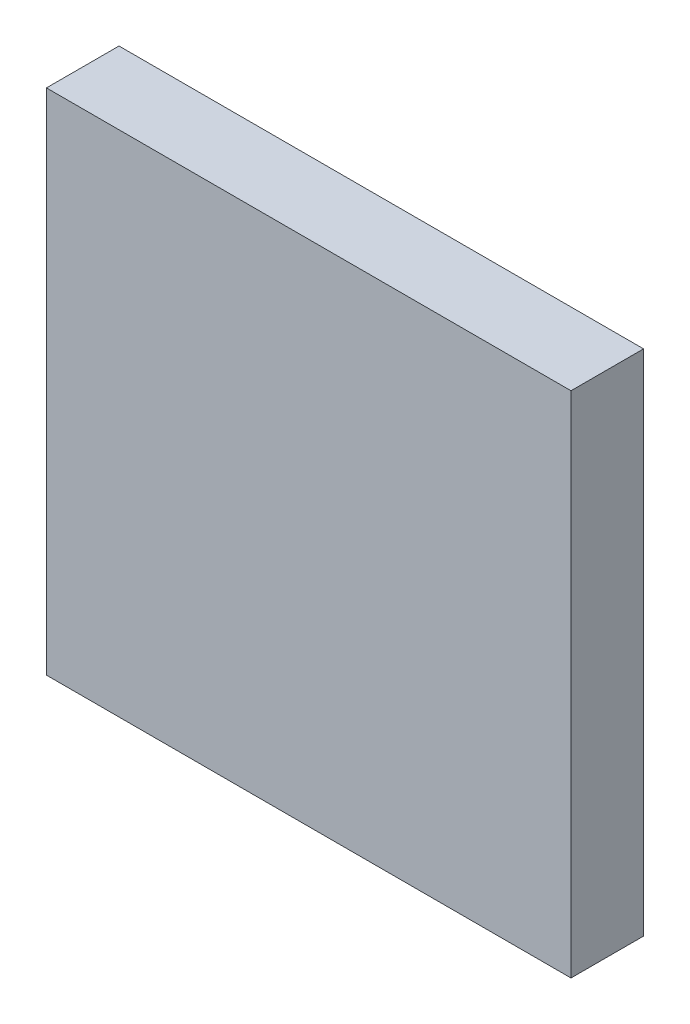
ISO-10303-21;
HEADER;
FILE_DESCRIPTION(('STEP AP214'),'2;1');
FILE_NAME('part.step','',(''),(''),'','','');
FILE_SCHEMA(('AUTOMOTIVE_DESIGN { 1 0 10303 214 1 1 1 1 }'));
ENDSEC;
DATA;
#1=APPLICATION_CONTEXT('core data for automotive mechanical design processes');
#2=APPLICATION_PROTOCOL_DEFINITION('international standard','automotive_design',2000,#1);
#3=PRODUCT_CONTEXT('',#1,'mechanical');
#4=PRODUCT('Part','Part','',(#3));
#5=PRODUCT_RELATED_PRODUCT_CATEGORY('part','',(#4));
#6=PRODUCT_DEFINITION_FORMATION('','',#4);
#7=PRODUCT_DEFINITION_CONTEXT('part definition',#1,'design');
#8=PRODUCT_DEFINITION('design','',#6,#7);
#9=PRODUCT_DEFINITION_SHAPE('','',#8);
#10=(LENGTH_UNIT() NAMED_UNIT(*) SI_UNIT(.MILLI.,.METRE.));
#11=(NAMED_UNIT(*) PLANE_ANGLE_UNIT() SI_UNIT($,.RADIAN.));
#12=(NAMED_UNIT(*) SI_UNIT($,.STERADIAN.) SOLID_ANGLE_UNIT());
#13=UNCERTAINTY_MEASURE_WITH_UNIT(LENGTH_MEASURE(1.E-05),#10,'distance_accuracy_value','');
#14=(GEOMETRIC_REPRESENTATION_CONTEXT(3) GLOBAL_UNCERTAINTY_ASSIGNED_CONTEXT((#13)) GLOBAL_UNIT_ASSIGNED_CONTEXT((#10,
#11,#12)) REPRESENTATION_CONTEXT('',''));
#15=CARTESIAN_POINT('',(0.,0.,0.));
#16=DIRECTION('',(0.,0.,1.));
#17=DIRECTION('',(1.,0.,0.));
#18=AXIS2_PLACEMENT_3D('',#15,#16,#17);
#19=CARTESIAN_POINT('',(47.,45.57,13.));
#20=DIRECTION('',(-1.,0.,0.));
#21=DIRECTION('',(0.,-1.,0.));
#22=AXIS2_PLACEMENT_3D('',#19,#20,#21);
#23=PLANE('',#22);
#24=DIRECTION('',(0.,1.,0.));
#25=VECTOR('',#24,1.);
#26=CARTESIAN_POINT('',(47.,45.57,0.));
#27=LINE('',#26,#25);
#28=CARTESIAN_POINT('',(47.,-45.57,0.));
#29=VERTEX_POINT('',#28);
#30=CARTESIAN_POINT('',(47.,45.57,0.));
#31=VERTEX_POINT('',#30);
#32=EDGE_CURVE('E99',#29,#31,#27,.T.);
#33=ORIENTED_EDGE('',*,*,#32,.T.);
#34=DIRECTION('',(0.,0.,-1.));
#35=VECTOR('',#34,1.);
#36=CARTESIAN_POINT('',(47.,45.57,13.));
#37=LINE('',#36,#35);
#38=CARTESIAN_POINT('',(47.,45.57,13.));
#39=VERTEX_POINT('',#38);
#40=EDGE_CURVE('E11',#39,#31,#37,.T.);
#41=ORIENTED_EDGE('',*,*,#40,.F.);
#42=DIRECTION('',(0.,1.,0.));
#43=VECTOR('',#42,1.);
#44=CARTESIAN_POINT('',(47.,45.57,13.));
#45=LINE('',#44,#43);
#46=CARTESIAN_POINT('',(47.,-45.57,13.));
#47=VERTEX_POINT('',#46);
#48=EDGE_CURVE('E87',#47,#39,#45,.T.);
#49=ORIENTED_EDGE('',*,*,#48,.F.);
#50=DIRECTION('',(0.,0.,-1.));
#51=VECTOR('',#50,1.);
#52=CARTESIAN_POINT('',(47.,-45.57,13.));
#53=LINE('',#52,#51);
#54=EDGE_CURVE('E95',#47,#29,#53,.T.);
#55=ORIENTED_EDGE('',*,*,#54,.T.);
#56=EDGE_LOOP('',(#33,#41,#49,#55));
#57=FACE_BOUND('',#56,.T.);
#58=ADVANCED_FACE('F36',(#57),#23,.F.);
#59=CARTESIAN_POINT('',(-47.,45.57,13.));
#60=DIRECTION('',(0.,-1.,0.));
#61=DIRECTION('',(0.,0.,-1.));
#62=AXIS2_PLACEMENT_3D('',#59,#60,#61);
#63=PLANE('',#62);
#64=DIRECTION('',(-1.,0.,0.));
#65=VECTOR('',#64,1.);
#66=CARTESIAN_POINT('',(-47.,45.57,0.));
#67=LINE('',#66,#65);
#68=CARTESIAN_POINT('',(-47.,45.57,0.));
#69=VERTEX_POINT('',#68);
#70=EDGE_CURVE('E91',#31,#69,#67,.T.);
#71=ORIENTED_EDGE('',*,*,#70,.T.);
#72=DIRECTION('',(0.,0.,-1.));
#73=VECTOR('',#72,1.);
#74=CARTESIAN_POINT('',(-47.,45.57,13.));
#75=LINE('',#74,#73);
#76=CARTESIAN_POINT('',(-47.,45.57,13.));
#77=VERTEX_POINT('',#76);
#78=EDGE_CURVE('E44',#77,#69,#75,.T.);
#79=ORIENTED_EDGE('',*,*,#78,.F.);
#80=DIRECTION('',(-1.,0.,0.));
#81=VECTOR('',#80,1.);
#82=CARTESIAN_POINT('',(-47.,45.57,13.));
#83=LINE('',#82,#81);
#84=EDGE_CURVE('E82',#39,#77,#83,.T.);
#85=ORIENTED_EDGE('',*,*,#84,.F.);
#86=ORIENTED_EDGE('',*,*,#40,.T.);
#87=EDGE_LOOP('',(#71,#79,#85,#86));
#88=FACE_BOUND('',#87,.T.);
#89=ADVANCED_FACE('F90',(#88),#63,.F.);
#90=CARTESIAN_POINT('',(-47.,45.57,13.));
#91=DIRECTION('',(1.,0.,0.));
#92=DIRECTION('',(0.,1.,0.));
#93=AXIS2_PLACEMENT_3D('',#90,#91,#92);
#94=PLANE('',#93);
#95=DIRECTION('',(0.,-1.,0.));
#96=VECTOR('',#95,1.);
#97=CARTESIAN_POINT('',(-47.,45.57,0.));
#98=LINE('',#97,#96);
#99=CARTESIAN_POINT('',(-47.,-45.57,0.));
#100=VERTEX_POINT('',#99);
#101=EDGE_CURVE('E69',#69,#100,#98,.T.);
#102=ORIENTED_EDGE('',*,*,#101,.T.);
#103=DIRECTION('',(0.,0.,-1.));
#104=VECTOR('',#103,1.);
#105=CARTESIAN_POINT('',(-47.,-45.57,13.));
#106=LINE('',#105,#104);
#107=CARTESIAN_POINT('',(-47.,-45.57,13.));
#108=VERTEX_POINT('',#107);
#109=EDGE_CURVE('E92',#108,#100,#106,.T.);
#110=ORIENTED_EDGE('',*,*,#109,.F.);
#111=DIRECTION('',(0.,-1.,0.));
#112=VECTOR('',#111,1.);
#113=CARTESIAN_POINT('',(-47.,45.57,13.));
#114=LINE('',#113,#112);
#115=EDGE_CURVE('E85',#77,#108,#114,.T.);
#116=ORIENTED_EDGE('',*,*,#115,.F.);
#117=ORIENTED_EDGE('',*,*,#78,.T.);
#118=EDGE_LOOP('',(#102,#110,#116,#117));
#119=FACE_BOUND('',#118,.T.);
#120=ADVANCED_FACE('F93',(#119),#94,.F.);
#121=CARTESIAN_POINT('',(-47.,-45.57,13.));
#122=DIRECTION('',(0.,1.,0.));
#123=DIRECTION('',(0.,0.,1.));
#124=AXIS2_PLACEMENT_3D('',#121,#122,#123);
#125=PLANE('',#124);
#126=DIRECTION('',(1.,0.,0.));
#127=VECTOR('',#126,1.);
#128=CARTESIAN_POINT('',(-47.,-45.57,0.));
#129=LINE('',#128,#127);
#130=EDGE_CURVE('E75',#100,#29,#129,.T.);
#131=ORIENTED_EDGE('',*,*,#130,.T.);
#132=ORIENTED_EDGE('',*,*,#54,.F.);
#133=DIRECTION('',(1.,0.,0.));
#134=VECTOR('',#133,1.);
#135=CARTESIAN_POINT('',(-47.,-45.57,13.));
#136=LINE('',#135,#134);
#137=EDGE_CURVE('E52',#108,#47,#136,.T.);
#138=ORIENTED_EDGE('',*,*,#137,.F.);
#139=ORIENTED_EDGE('',*,*,#109,.T.);
#140=EDGE_LOOP('',(#131,#132,#138,#139));
#141=FACE_BOUND('',#140,.T.);
#142=ADVANCED_FACE('F106',(#141),#125,.F.);
#143=CARTESIAN_POINT('',(0.,0.,13.));
#144=DIRECTION('',(0.,0.,1.));
#145=DIRECTION('',(1.,0.,0.));
#146=AXIS2_PLACEMENT_3D('',#143,#144,#145);
#147=PLANE('',#146);
#148=ORIENTED_EDGE('',*,*,#48,.T.);
#149=ORIENTED_EDGE('',*,*,#84,.T.);
#150=ORIENTED_EDGE('',*,*,#115,.T.);
#151=ORIENTED_EDGE('',*,*,#137,.T.);
#152=EDGE_LOOP('',(#148,#149,#150,#151));
#153=FACE_BOUND('',#152,.T.);
#154=ADVANCED_FACE('F83',(#153),#147,.T.);
#155=CARTESIAN_POINT('',(0.,0.,0.));
#156=DIRECTION('',(0.,0.,1.));
#157=DIRECTION('',(1.,0.,0.));
#158=AXIS2_PLACEMENT_3D('',#155,#156,#157);
#159=PLANE('',#158);
#160=ORIENTED_EDGE('',*,*,#32,.F.);
#161=ORIENTED_EDGE('',*,*,#130,.F.);
#162=ORIENTED_EDGE('',*,*,#101,.F.);
#163=ORIENTED_EDGE('',*,*,#70,.F.);
#164=EDGE_LOOP('',(#160,#161,#162,#163));
#165=FACE_BOUND('',#164,.T.);
#166=ADVANCED_FACE('F109',(#165),#159,.F.);
#167=CLOSED_SHELL('',(#58,#89,#120,#142,#154,#166));
#168=MANIFOLD_SOLID_BREP('B2',#167);
#169=ADVANCED_BREP_SHAPE_REPRESENTATION('',(#18,#168),#14);
#170=SHAPE_DEFINITION_REPRESENTATION(#9,#169);
ENDSEC;
END-ISO-10303-21;
